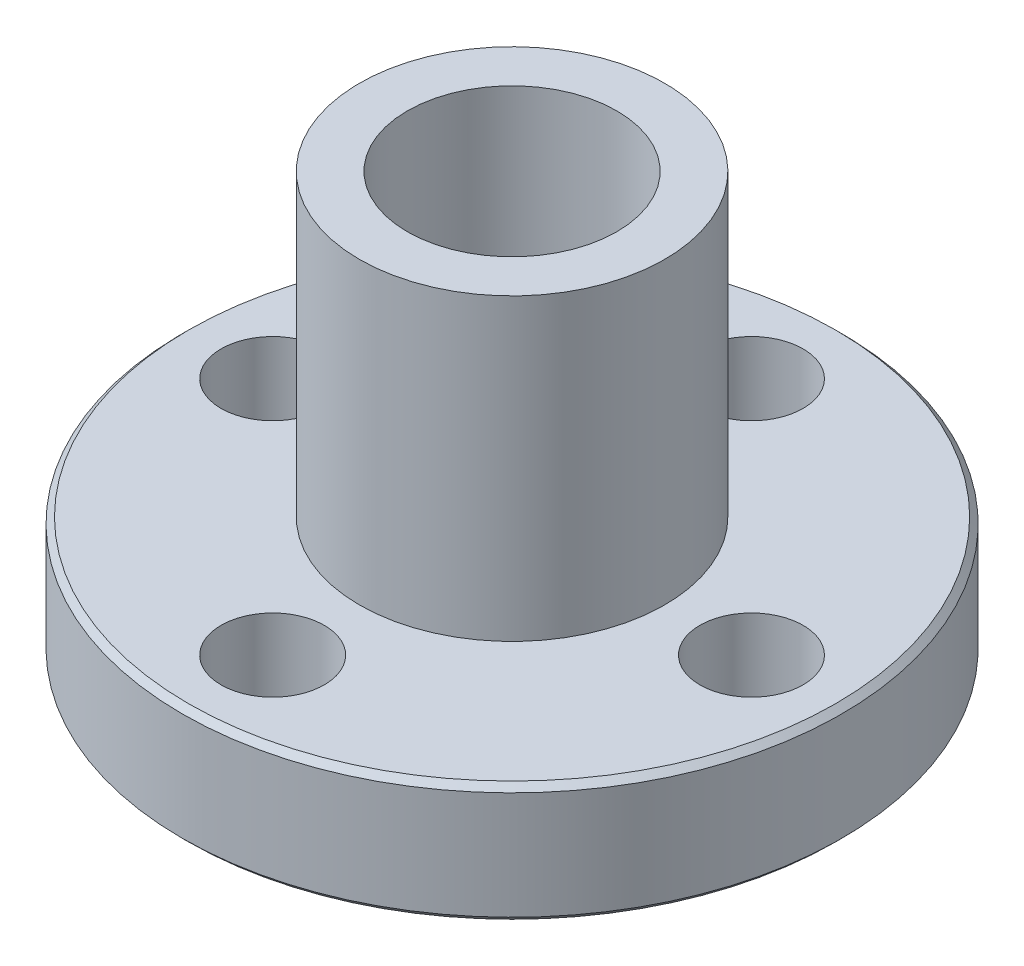
ISO-10303-21;
HEADER;
FILE_DESCRIPTION(('STEP AP214'),'2;1');
FILE_NAME('part.step','',(''),(''),'','','');
FILE_SCHEMA(('AUTOMOTIVE_DESIGN { 1 0 10303 214 1 1 1 1 }'));
ENDSEC;
DATA;
#1=APPLICATION_CONTEXT('core data for automotive mechanical design processes');
#2=APPLICATION_PROTOCOL_DEFINITION('international standard','automotive_design',2000,#1);
#3=PRODUCT_CONTEXT('',#1,'mechanical');
#4=PRODUCT('Part','Part','',(#3));
#5=PRODUCT_RELATED_PRODUCT_CATEGORY('part','',(#4));
#6=PRODUCT_DEFINITION_FORMATION('','',#4);
#7=PRODUCT_DEFINITION_CONTEXT('part definition',#1,'design');
#8=PRODUCT_DEFINITION('design','',#6,#7);
#9=PRODUCT_DEFINITION_SHAPE('','',#8);
#10=(LENGTH_UNIT() NAMED_UNIT(*) SI_UNIT(.MILLI.,.METRE.));
#11=(NAMED_UNIT(*) PLANE_ANGLE_UNIT() SI_UNIT($,.RADIAN.));
#12=(NAMED_UNIT(*) SI_UNIT($,.STERADIAN.) SOLID_ANGLE_UNIT());
#13=UNCERTAINTY_MEASURE_WITH_UNIT(LENGTH_MEASURE(1.E-05),#10,'distance_accuracy_value','');
#14=(GEOMETRIC_REPRESENTATION_CONTEXT(3) GLOBAL_UNCERTAINTY_ASSIGNED_CONTEXT((#13)) GLOBAL_UNIT_ASSIGNED_CONTEXT((#10,
#11,#12)) REPRESENTATION_CONTEXT('',''));
#15=CARTESIAN_POINT('',(0.,0.,0.));
#16=DIRECTION('',(0.,0.,1.));
#17=DIRECTION('',(1.,0.,0.));
#18=AXIS2_PLACEMENT_3D('',#15,#16,#17);
#19=CARTESIAN_POINT('',(0.,0.,0.));
#20=DIRECTION('',(0.,1.,0.));
#21=DIRECTION('',(0.,0.,1.));
#22=AXIS2_PLACEMENT_3D('',#19,#20,#21);
#23=PLANE('',#22);
#24=CARTESIAN_POINT('',(-8.,0.,0.));
#25=DIRECTION('',(0.,1.,0.));
#26=DIRECTION('',(0.,0.,1.));
#27=AXIS2_PLACEMENT_3D('',#24,#25,#26);
#28=CIRCLE('',#27,1.725);
#29=CARTESIAN_POINT('',(-8.,0.,1.725));
#30=VERTEX_POINT('',#29);
#31=EDGE_CURVE('E86',#30,#30,#28,.T.);
#32=ORIENTED_EDGE('',*,*,#31,.T.);
#33=EDGE_LOOP('',(#32));
#34=FACE_BOUND('',#33,.T.);
#35=CARTESIAN_POINT('',(0.,0.,-8.));
#36=DIRECTION('',(0.,1.,0.));
#37=DIRECTION('',(0.,0.,1.));
#38=AXIS2_PLACEMENT_3D('',#35,#36,#37);
#39=CIRCLE('',#38,1.725);
#40=CARTESIAN_POINT('',(0.,0.,-6.275));
#41=VERTEX_POINT('',#40);
#42=EDGE_CURVE('E80',#41,#41,#39,.T.);
#43=ORIENTED_EDGE('',*,*,#42,.T.);
#44=EDGE_LOOP('',(#43));
#45=FACE_BOUND('',#44,.T.);
#46=CARTESIAN_POINT('',(0.,0.,8.));
#47=DIRECTION('',(0.,1.,0.));
#48=DIRECTION('',(0.,0.,1.));
#49=AXIS2_PLACEMENT_3D('',#46,#47,#48);
#50=CIRCLE('',#49,1.725);
#51=CARTESIAN_POINT('',(0.,0.,9.725));
#52=VERTEX_POINT('',#51);
#53=EDGE_CURVE('E74',#52,#52,#50,.T.);
#54=ORIENTED_EDGE('',*,*,#53,.T.);
#55=EDGE_LOOP('',(#54));
#56=FACE_BOUND('',#55,.T.);
#57=CARTESIAN_POINT('',(8.,0.,0.));
#58=DIRECTION('',(0.,1.,0.));
#59=DIRECTION('',(0.,0.,1.));
#60=AXIS2_PLACEMENT_3D('',#57,#58,#59);
#61=CIRCLE('',#60,1.725);
#62=CARTESIAN_POINT('',(8.,0.,1.725));
#63=VERTEX_POINT('',#62);
#64=EDGE_CURVE('E68',#63,#63,#61,.T.);
#65=ORIENTED_EDGE('',*,*,#64,.T.);
#66=EDGE_LOOP('',(#65));
#67=FACE_BOUND('',#66,.T.);
#68=CARTESIAN_POINT('',(0.,0.,0.));
#69=DIRECTION('',(0.,1.,0.));
#70=DIRECTION('',(0.,0.,1.));
#71=AXIS2_PLACEMENT_3D('',#68,#69,#70);
#72=CIRCLE('',#71,10.8129526367968);
#73=CARTESIAN_POINT('',(0.,0.,10.8129526367968));
#74=VERTEX_POINT('',#73);
#75=EDGE_CURVE('E37',#74,#74,#72,.F.);
#76=ORIENTED_EDGE('',*,*,#75,.T.);
#77=EDGE_LOOP('',(#76));
#78=FACE_BOUND('',#77,.T.);
#79=CARTESIAN_POINT('',(0.,0.,0.));
#80=DIRECTION('',(0.,1.,0.));
#81=DIRECTION('',(0.,0.,1.));
#82=AXIS2_PLACEMENT_3D('',#79,#80,#81);
#83=CIRCLE('',#82,5.125);
#84=CARTESIAN_POINT('',(0.,0.,5.125));
#85=VERTEX_POINT('',#84);
#86=EDGE_CURVE('E50',#85,#85,#83,.F.);
#87=ORIENTED_EDGE('',*,*,#86,.F.);
#88=EDGE_LOOP('',(#87));
#89=FACE_BOUND('',#88,.T.);
#90=ADVANCED_FACE('F30',(#34,#45,#56,#67,#78,#89),#23,.F.);
#91=CARTESIAN_POINT('',(0.,4.,0.));
#92=DIRECTION('',(0.,1.,0.));
#93=DIRECTION('',(0.,0.,1.));
#94=AXIS2_PLACEMENT_3D('',#91,#92,#93);
#95=PLANE('',#94);
#96=CARTESIAN_POINT('',(-8.,4.,0.));
#97=DIRECTION('',(0.,1.,0.));
#98=DIRECTION('',(0.,0.,1.));
#99=AXIS2_PLACEMENT_3D('',#96,#97,#98);
#100=CIRCLE('',#99,1.725);
#101=CARTESIAN_POINT('',(-8.,4.,1.725));
#102=VERTEX_POINT('',#101);
#103=EDGE_CURVE('E89',#102,#102,#100,.T.);
#104=ORIENTED_EDGE('',*,*,#103,.F.);
#105=EDGE_LOOP('',(#104));
#106=FACE_BOUND('',#105,.T.);
#107=CARTESIAN_POINT('',(0.,4.,-8.));
#108=DIRECTION('',(0.,1.,0.));
#109=DIRECTION('',(0.,0.,1.));
#110=AXIS2_PLACEMENT_3D('',#107,#108,#109);
#111=CIRCLE('',#110,1.725);
#112=CARTESIAN_POINT('',(0.,4.,-6.275));
#113=VERTEX_POINT('',#112);
#114=EDGE_CURVE('E83',#113,#113,#111,.T.);
#115=ORIENTED_EDGE('',*,*,#114,.F.);
#116=EDGE_LOOP('',(#115));
#117=FACE_BOUND('',#116,.T.);
#118=CARTESIAN_POINT('',(0.,4.,8.));
#119=DIRECTION('',(0.,1.,0.));
#120=DIRECTION('',(0.,0.,1.));
#121=AXIS2_PLACEMENT_3D('',#118,#119,#120);
#122=CIRCLE('',#121,1.725);
#123=CARTESIAN_POINT('',(0.,4.,9.725));
#124=VERTEX_POINT('',#123);
#125=EDGE_CURVE('E77',#124,#124,#122,.T.);
#126=ORIENTED_EDGE('',*,*,#125,.F.);
#127=EDGE_LOOP('',(#126));
#128=FACE_BOUND('',#127,.T.);
#129=CARTESIAN_POINT('',(8.,4.,0.));
#130=DIRECTION('',(0.,1.,0.));
#131=DIRECTION('',(0.,0.,1.));
#132=AXIS2_PLACEMENT_3D('',#129,#130,#131);
#133=CIRCLE('',#132,1.725);
#134=CARTESIAN_POINT('',(8.,4.,1.725));
#135=VERTEX_POINT('',#134);
#136=EDGE_CURVE('E71',#135,#135,#133,.T.);
#137=ORIENTED_EDGE('',*,*,#136,.F.);
#138=EDGE_LOOP('',(#137));
#139=FACE_BOUND('',#138,.T.);
#140=CARTESIAN_POINT('',(0.,4.,0.));
#141=DIRECTION('',(0.,1.,0.));
#142=DIRECTION('',(0.,0.,1.));
#143=AXIS2_PLACEMENT_3D('',#140,#141,#142);
#144=CIRCLE('',#143,10.8129526367968);
#145=CARTESIAN_POINT('',(0.,4.,10.8129526367968));
#146=VERTEX_POINT('',#145);
#147=EDGE_CURVE('E10',#146,#146,#144,.T.);
#148=ORIENTED_EDGE('',*,*,#147,.T.);
#149=EDGE_LOOP('',(#148));
#150=FACE_BOUND('',#149,.T.);
#151=CARTESIAN_POINT('',(0.,4.,0.));
#152=DIRECTION('',(0.,1.,0.));
#153=DIRECTION('',(0.,0.,1.));
#154=AXIS2_PLACEMENT_3D('',#151,#152,#153);
#155=CIRCLE('',#154,5.1);
#156=CARTESIAN_POINT('',(0.,4.,5.1));
#157=VERTEX_POINT('',#156);
#158=EDGE_CURVE('E54',#157,#157,#155,.T.);
#159=ORIENTED_EDGE('',*,*,#158,.F.);
#160=EDGE_LOOP('',(#159));
#161=FACE_BOUND('',#160,.T.);
#162=ADVANCED_FACE('F96',(#106,#117,#128,#139,#150,#161),#95,.T.);
#163=CARTESIAN_POINT('',(0.,4.,0.));
#164=DIRECTION('',(0.,-1.,0.));
#165=DIRECTION('',(0.,0.,-1.));
#166=AXIS2_PLACEMENT_3D('',#163,#164,#165);
#167=CYLINDRICAL_SURFACE('',#166,11.0129526367968);
#168=CARTESIAN_POINT('',(0.,0.200000000000001,0.));
#169=DIRECTION('',(0.,1.,0.));
#170=DIRECTION('',(0.,0.,1.));
#171=AXIS2_PLACEMENT_3D('',#168,#169,#170);
#172=CIRCLE('',#171,11.0129526367968);
#173=CARTESIAN_POINT('',(0.,0.200000000000001,11.0129526367968));
#174=VERTEX_POINT('',#173);
#175=EDGE_CURVE('E41',#174,#174,#172,.T.);
#176=ORIENTED_EDGE('',*,*,#175,.T.);
#177=EDGE_LOOP('',(#176));
#178=FACE_BOUND('',#177,.T.);
#179=CARTESIAN_POINT('',(0.,3.8,0.));
#180=DIRECTION('',(0.,1.,0.));
#181=DIRECTION('',(0.,0.,1.));
#182=AXIS2_PLACEMENT_3D('',#179,#180,#181);
#183=CIRCLE('',#182,11.0129526367968);
#184=CARTESIAN_POINT('',(0.,3.8,11.0129526367968));
#185=VERTEX_POINT('',#184);
#186=EDGE_CURVE('E45',#185,#185,#183,.F.);
#187=ORIENTED_EDGE('',*,*,#186,.T.);
#188=EDGE_LOOP('',(#187));
#189=FACE_BOUND('',#188,.T.);
#190=ADVANCED_FACE('F99',(#178,#189),#167,.T.);
#191=CARTESIAN_POINT('',(0.,4.,0.));
#192=DIRECTION('',(0.,-1.,0.));
#193=DIRECTION('',(0.,0.,-1.));
#194=AXIS2_PLACEMENT_3D('',#191,#192,#193);
#195=CYLINDRICAL_SURFACE('',#194,3.5);
#196=CARTESIAN_POINT('',(0.,14.,0.));
#197=DIRECTION('',(0.,1.,0.));
#198=DIRECTION('',(0.,0.,1.));
#199=AXIS2_PLACEMENT_3D('',#196,#197,#198);
#200=CIRCLE('',#199,3.5);
#201=CARTESIAN_POINT('',(0.,14.,3.5));
#202=VERTEX_POINT('',#201);
#203=EDGE_CURVE('E57',#202,#202,#200,.T.);
#204=ORIENTED_EDGE('',*,*,#203,.T.);
#205=EDGE_LOOP('',(#204));
#206=FACE_BOUND('',#205,.T.);
#207=CARTESIAN_POINT('',(0.,-1.25,0.));
#208=DIRECTION('',(0.,-1.,0.));
#209=DIRECTION('',(0.,0.,-1.));
#210=AXIS2_PLACEMENT_3D('',#207,#208,#209);
#211=CIRCLE('',#210,3.5);
#212=CARTESIAN_POINT('',(0.,-1.25,-3.5));
#213=VERTEX_POINT('',#212);
#214=EDGE_CURVE('E65',#213,#213,#211,.T.);
#215=ORIENTED_EDGE('',*,*,#214,.T.);
#216=EDGE_LOOP('',(#215));
#217=FACE_BOUND('',#216,.T.);
#218=ADVANCED_FACE('F122',(#206,#217),#195,.F.);
#219=CARTESIAN_POINT('',(0.,14.,0.));
#220=DIRECTION('',(0.,1.,0.));
#221=DIRECTION('',(0.,0.,1.));
#222=AXIS2_PLACEMENT_3D('',#219,#220,#221);
#223=PLANE('',#222);
#224=CARTESIAN_POINT('',(0.,14.,0.));
#225=DIRECTION('',(0.,1.,0.));
#226=DIRECTION('',(0.,0.,1.));
#227=AXIS2_PLACEMENT_3D('',#224,#225,#226);
#228=CIRCLE('',#227,5.1);
#229=CARTESIAN_POINT('',(0.,14.,5.1));
#230=VERTEX_POINT('',#229);
#231=EDGE_CURVE('E53',#230,#230,#228,.T.);
#232=ORIENTED_EDGE('',*,*,#231,.T.);
#233=EDGE_LOOP('',(#232));
#234=FACE_BOUND('',#233,.T.);
#235=ORIENTED_EDGE('',*,*,#203,.F.);
#236=EDGE_LOOP('',(#235));
#237=FACE_BOUND('',#236,.T.);
#238=ADVANCED_FACE('F112',(#234,#237),#223,.T.);
#239=CARTESIAN_POINT('',(0.,14.,0.));
#240=DIRECTION('',(0.,-1.,0.));
#241=DIRECTION('',(0.,0.,-1.));
#242=AXIS2_PLACEMENT_3D('',#239,#240,#241);
#243=CYLINDRICAL_SURFACE('',#242,5.1);
#244=ORIENTED_EDGE('',*,*,#231,.F.);
#245=EDGE_LOOP('',(#244));
#246=FACE_BOUND('',#245,.T.);
#247=ORIENTED_EDGE('',*,*,#158,.T.);
#248=EDGE_LOOP('',(#247));
#249=FACE_BOUND('',#248,.T.);
#250=ADVANCED_FACE('F109',(#246,#249),#243,.T.);
#251=CARTESIAN_POINT('',(0.,-1.25,0.));
#252=DIRECTION('',(0.,-1.,0.));
#253=DIRECTION('',(0.,0.,-1.));
#254=AXIS2_PLACEMENT_3D('',#251,#252,#253);
#255=PLANE('',#254);
#256=CARTESIAN_POINT('',(0.,-1.25,0.));
#257=DIRECTION('',(0.,-1.,0.));
#258=DIRECTION('',(0.,0.,-1.));
#259=AXIS2_PLACEMENT_3D('',#256,#257,#258);
#260=CIRCLE('',#259,5.125);
#261=CARTESIAN_POINT('',(0.,-1.25,-5.125));
#262=VERTEX_POINT('',#261);
#263=EDGE_CURVE('E62',#262,#262,#260,.T.);
#264=ORIENTED_EDGE('',*,*,#263,.T.);
#265=EDGE_LOOP('',(#264));
#266=FACE_BOUND('',#265,.T.);
#267=ORIENTED_EDGE('',*,*,#214,.F.);
#268=EDGE_LOOP('',(#267));
#269=FACE_BOUND('',#268,.T.);
#270=ADVANCED_FACE('F111',(#266,#269),#255,.T.);
#271=CARTESIAN_POINT('',(0.,-1.25,0.));
#272=DIRECTION('',(0.,1.,0.));
#273=DIRECTION('',(0.,0.,1.));
#274=AXIS2_PLACEMENT_3D('',#271,#272,#273);
#275=CYLINDRICAL_SURFACE('',#274,5.125);
#276=ORIENTED_EDGE('',*,*,#263,.F.);
#277=EDGE_LOOP('',(#276));
#278=FACE_BOUND('',#277,.T.);
#279=ORIENTED_EDGE('',*,*,#86,.T.);
#280=EDGE_LOOP('',(#279));
#281=FACE_BOUND('',#280,.T.);
#282=ADVANCED_FACE('F119',(#278,#281),#275,.T.);
#283=CARTESIAN_POINT('',(0.,0.200000000000001,0.));
#284=DIRECTION('',(0.,1.,0.));
#285=DIRECTION('',(0.,0.,1.));
#286=AXIS2_PLACEMENT_3D('',#283,#284,#285);
#287=CONICAL_SURFACE('',#286,11.0129526367968,0.785398163397453);
#288=ORIENTED_EDGE('',*,*,#75,.F.);
#289=EDGE_LOOP('',(#288));
#290=FACE_BOUND('',#289,.T.);
#291=ORIENTED_EDGE('',*,*,#175,.F.);
#292=EDGE_LOOP('',(#291));
#293=FACE_BOUND('',#292,.T.);
#294=ADVANCED_FACE('F136',(#290,#293),#287,.T.);
#295=CARTESIAN_POINT('',(0.,4.,0.));
#296=DIRECTION('',(0.,-1.,0.));
#297=DIRECTION('',(0.,0.,-1.));
#298=AXIS2_PLACEMENT_3D('',#295,#296,#297);
#299=CONICAL_SURFACE('',#298,10.8129526367968,0.785398163397448);
#300=ORIENTED_EDGE('',*,*,#186,.F.);
#301=EDGE_LOOP('',(#300));
#302=FACE_BOUND('',#301,.T.);
#303=ORIENTED_EDGE('',*,*,#147,.F.);
#304=EDGE_LOOP('',(#303));
#305=FACE_BOUND('',#304,.T.);
#306=ADVANCED_FACE('F32',(#302,#305),#299,.T.);
#307=CARTESIAN_POINT('',(8.,-6.,0.));
#308=DIRECTION('',(0.,1.,0.));
#309=DIRECTION('',(0.,0.,1.));
#310=AXIS2_PLACEMENT_3D('',#307,#308,#309);
#311=CYLINDRICAL_SURFACE('',#310,1.725);
#312=ORIENTED_EDGE('',*,*,#136,.T.);
#313=EDGE_LOOP('',(#312));
#314=FACE_BOUND('',#313,.T.);
#315=ORIENTED_EDGE('',*,*,#64,.F.);
#316=EDGE_LOOP('',(#315));
#317=FACE_BOUND('',#316,.T.);
#318=ADVANCED_FACE('F143',(#314,#317),#311,.F.);
#319=CARTESIAN_POINT('',(0.,-6.,8.));
#320=DIRECTION('',(0.,1.,0.));
#321=DIRECTION('',(0.,0.,1.));
#322=AXIS2_PLACEMENT_3D('',#319,#320,#321);
#323=CYLINDRICAL_SURFACE('',#322,1.725);
#324=ORIENTED_EDGE('',*,*,#125,.T.);
#325=EDGE_LOOP('',(#324));
#326=FACE_BOUND('',#325,.T.);
#327=ORIENTED_EDGE('',*,*,#53,.F.);
#328=EDGE_LOOP('',(#327));
#329=FACE_BOUND('',#328,.T.);
#330=ADVANCED_FACE('F159',(#326,#329),#323,.F.);
#331=CARTESIAN_POINT('',(0.,-6.,-8.));
#332=DIRECTION('',(0.,1.,0.));
#333=DIRECTION('',(0.,0.,1.));
#334=AXIS2_PLACEMENT_3D('',#331,#332,#333);
#335=CYLINDRICAL_SURFACE('',#334,1.725);
#336=ORIENTED_EDGE('',*,*,#114,.T.);
#337=EDGE_LOOP('',(#336));
#338=FACE_BOUND('',#337,.T.);
#339=ORIENTED_EDGE('',*,*,#42,.F.);
#340=EDGE_LOOP('',(#339));
#341=FACE_BOUND('',#340,.T.);
#342=ADVANCED_FACE('F163',(#338,#341),#335,.F.);
#343=CARTESIAN_POINT('',(-8.,-6.,0.));
#344=DIRECTION('',(0.,1.,0.));
#345=DIRECTION('',(0.,0.,1.));
#346=AXIS2_PLACEMENT_3D('',#343,#344,#345);
#347=CYLINDRICAL_SURFACE('',#346,1.725);
#348=ORIENTED_EDGE('',*,*,#103,.T.);
#349=EDGE_LOOP('',(#348));
#350=FACE_BOUND('',#349,.T.);
#351=ORIENTED_EDGE('',*,*,#31,.F.);
#352=EDGE_LOOP('',(#351));
#353=FACE_BOUND('',#352,.T.);
#354=ADVANCED_FACE('F93',(#350,#353),#347,.F.);
#355=CLOSED_SHELL('',(#90,#162,#190,#218,#238,#250,#270,#282,#294,#306,#318,#330,#342,#354));
#356=MANIFOLD_SOLID_BREP('B2',#355);
#357=ADVANCED_BREP_SHAPE_REPRESENTATION('',(#18,#356),#14);
#358=SHAPE_DEFINITION_REPRESENTATION(#9,#357);
ENDSEC;
END-ISO-10303-21;
